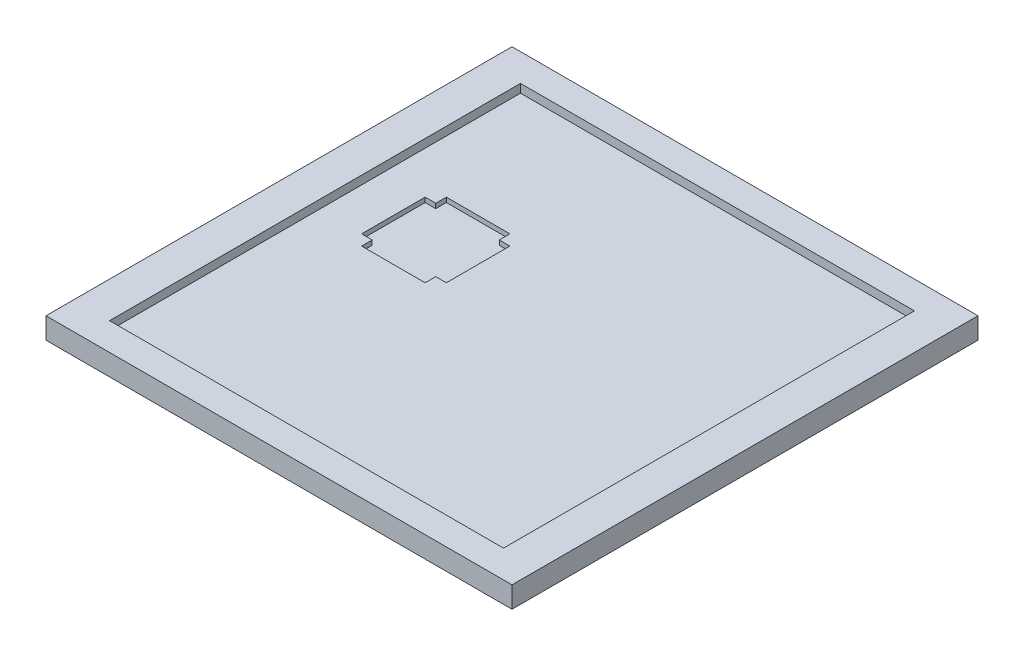
ISO-10303-21;
HEADER;
FILE_DESCRIPTION(('STEP AP214'),'2;1');
FILE_NAME('part.step','',(''),(''),'','','');
FILE_SCHEMA(('AUTOMOTIVE_DESIGN { 1 0 10303 214 1 1 1 1 }'));
ENDSEC;
DATA;
#1=APPLICATION_CONTEXT('core data for automotive mechanical design processes');
#2=APPLICATION_PROTOCOL_DEFINITION('international standard','automotive_design',2000,#1);
#3=PRODUCT_CONTEXT('',#1,'mechanical');
#4=PRODUCT('Part','Part','',(#3));
#5=PRODUCT_RELATED_PRODUCT_CATEGORY('part','',(#4));
#6=PRODUCT_DEFINITION_FORMATION('','',#4);
#7=PRODUCT_DEFINITION_CONTEXT('part definition',#1,'design');
#8=PRODUCT_DEFINITION('design','',#6,#7);
#9=PRODUCT_DEFINITION_SHAPE('','',#8);
#10=(LENGTH_UNIT() NAMED_UNIT(*) SI_UNIT(.MILLI.,.METRE.));
#11=(NAMED_UNIT(*) PLANE_ANGLE_UNIT() SI_UNIT($,.RADIAN.));
#12=(NAMED_UNIT(*) SI_UNIT($,.STERADIAN.) SOLID_ANGLE_UNIT());
#13=UNCERTAINTY_MEASURE_WITH_UNIT(LENGTH_MEASURE(1.E-05),#10,'distance_accuracy_value','');
#14=(GEOMETRIC_REPRESENTATION_CONTEXT(3) GLOBAL_UNCERTAINTY_ASSIGNED_CONTEXT((#13)) GLOBAL_UNIT_ASSIGNED_CONTEXT((#10,
#11,#12)) REPRESENTATION_CONTEXT('',''));
#15=CARTESIAN_POINT('',(0.,0.,0.));
#16=DIRECTION('',(0.,0.,1.));
#17=DIRECTION('',(1.,0.,0.));
#18=AXIS2_PLACEMENT_3D('',#15,#16,#17);
#19=CARTESIAN_POINT('',(-68.8630136986301,5.,-38.3493150684931));
#20=DIRECTION('',(1.,0.,0.));
#21=DIRECTION('',(0.,0.,-1.));
#22=AXIS2_PLACEMENT_3D('',#19,#20,#21);
#23=PLANE('',#22);
#24=DIRECTION('',(0.,0.,1.));
#25=VECTOR('',#24,1.);
#26=CARTESIAN_POINT('',(-68.8630136986301,0.,-38.3493150684931));
#27=LINE('',#26,#25);
#28=CARTESIAN_POINT('',(-68.8630136986301,0.,-38.3493150684931));
#29=VERTEX_POINT('',#28);
#30=CARTESIAN_POINT('',(-68.8630136986301,0.,71.6506849315068));
#31=VERTEX_POINT('',#30);
#32=EDGE_CURVE('E296',#29,#31,#27,.T.);
#33=ORIENTED_EDGE('',*,*,#32,.T.);
#34=DIRECTION('',(0.,-1.,0.));
#35=VECTOR('',#34,1.);
#36=CARTESIAN_POINT('',(-68.8630136986301,5.,71.6506849315068));
#37=LINE('',#36,#35);
#38=CARTESIAN_POINT('',(-68.8630136986301,5.,71.6506849315068));
#39=VERTEX_POINT('',#38);
#40=EDGE_CURVE('E11',#39,#31,#37,.T.);
#41=ORIENTED_EDGE('',*,*,#40,.F.);
#42=DIRECTION('',(0.,0.,1.));
#43=VECTOR('',#42,1.);
#44=CARTESIAN_POINT('',(-68.8630136986301,5.,-38.3493150684931));
#45=LINE('',#44,#43);
#46=CARTESIAN_POINT('',(-68.8630136986301,5.,-38.3493150684931));
#47=VERTEX_POINT('',#46);
#48=EDGE_CURVE('E302',#47,#39,#45,.T.);
#49=ORIENTED_EDGE('',*,*,#48,.F.);
#50=DIRECTION('',(0.,-1.,0.));
#51=VECTOR('',#50,1.);
#52=CARTESIAN_POINT('',(-68.8630136986301,5.,-38.3493150684931));
#53=LINE('',#52,#51);
#54=EDGE_CURVE('E312',#47,#29,#53,.T.);
#55=ORIENTED_EDGE('',*,*,#54,.T.);
#56=EDGE_LOOP('',(#33,#41,#49,#55));
#57=FACE_BOUND('',#56,.T.);
#58=ADVANCED_FACE('F33',(#57),#23,.F.);
#59=CARTESIAN_POINT('',(-68.8630136986301,5.,71.6506849315068));
#60=DIRECTION('',(0.,0.,-1.));
#61=DIRECTION('',(-1.,0.,0.));
#62=AXIS2_PLACEMENT_3D('',#59,#60,#61);
#63=PLANE('',#62);
#64=DIRECTION('',(1.,0.,0.));
#65=VECTOR('',#64,1.);
#66=CARTESIAN_POINT('',(-68.8630136986301,0.,71.6506849315068));
#67=LINE('',#66,#65);
#68=CARTESIAN_POINT('',(41.1369863013699,0.,71.6506849315068));
#69=VERTEX_POINT('',#68);
#70=EDGE_CURVE('E315',#31,#69,#67,.T.);
#71=ORIENTED_EDGE('',*,*,#70,.T.);
#72=DIRECTION('',(0.,-1.,0.));
#73=VECTOR('',#72,1.);
#74=CARTESIAN_POINT('',(41.1369863013699,5.,71.6506849315068));
#75=LINE('',#74,#73);
#76=CARTESIAN_POINT('',(41.1369863013699,5.,71.6506849315068));
#77=VERTEX_POINT('',#76);
#78=EDGE_CURVE('E40',#77,#69,#75,.T.);
#79=ORIENTED_EDGE('',*,*,#78,.F.);
#80=DIRECTION('',(1.,0.,0.));
#81=VECTOR('',#80,1.);
#82=CARTESIAN_POINT('',(-68.8630136986301,5.,71.6506849315068));
#83=LINE('',#82,#81);
#84=EDGE_CURVE('E305',#39,#77,#83,.T.);
#85=ORIENTED_EDGE('',*,*,#84,.F.);
#86=ORIENTED_EDGE('',*,*,#40,.T.);
#87=EDGE_LOOP('',(#71,#79,#85,#86));
#88=FACE_BOUND('',#87,.T.);
#89=ADVANCED_FACE('F345',(#88),#63,.F.);
#90=CARTESIAN_POINT('',(41.1369863013699,5.,-38.3493150684931));
#91=DIRECTION('',(-1.,0.,0.));
#92=DIRECTION('',(0.,0.,1.));
#93=AXIS2_PLACEMENT_3D('',#90,#91,#92);
#94=PLANE('',#93);
#95=DIRECTION('',(0.,0.,-1.));
#96=VECTOR('',#95,1.);
#97=CARTESIAN_POINT('',(41.1369863013699,0.,-38.3493150684931));
#98=LINE('',#97,#96);
#99=CARTESIAN_POINT('',(41.1369863013699,0.,-38.3493150684931));
#100=VERTEX_POINT('',#99);
#101=EDGE_CURVE('E317',#69,#100,#98,.T.);
#102=ORIENTED_EDGE('',*,*,#101,.T.);
#103=DIRECTION('',(0.,-1.,0.));
#104=VECTOR('',#103,1.);
#105=CARTESIAN_POINT('',(41.1369863013699,5.,-38.3493150684931));
#106=LINE('',#105,#104);
#107=CARTESIAN_POINT('',(41.1369863013699,5.,-38.3493150684931));
#108=VERTEX_POINT('',#107);
#109=EDGE_CURVE('E322',#108,#100,#106,.T.);
#110=ORIENTED_EDGE('',*,*,#109,.F.);
#111=DIRECTION('',(0.,0.,-1.));
#112=VECTOR('',#111,1.);
#113=CARTESIAN_POINT('',(41.1369863013699,5.,-38.3493150684931));
#114=LINE('',#113,#112);
#115=EDGE_CURVE('E308',#77,#108,#114,.T.);
#116=ORIENTED_EDGE('',*,*,#115,.F.);
#117=ORIENTED_EDGE('',*,*,#78,.T.);
#118=EDGE_LOOP('',(#102,#110,#116,#117));
#119=FACE_BOUND('',#118,.T.);
#120=ADVANCED_FACE('F329',(#119),#94,.F.);
#121=CARTESIAN_POINT('',(-68.8630136986301,5.,-38.3493150684931));
#122=DIRECTION('',(0.,0.,1.));
#123=DIRECTION('',(1.,0.,0.));
#124=AXIS2_PLACEMENT_3D('',#121,#122,#123);
#125=PLANE('',#124);
#126=DIRECTION('',(-1.,0.,0.));
#127=VECTOR('',#126,1.);
#128=CARTESIAN_POINT('',(-68.8630136986301,0.,-38.3493150684931));
#129=LINE('',#128,#127);
#130=EDGE_CURVE('E306',#100,#29,#129,.T.);
#131=ORIENTED_EDGE('',*,*,#130,.T.);
#132=ORIENTED_EDGE('',*,*,#54,.F.);
#133=DIRECTION('',(-1.,0.,0.));
#134=VECTOR('',#133,1.);
#135=CARTESIAN_POINT('',(-68.8630136986301,5.,-38.3493150684931));
#136=LINE('',#135,#134);
#137=EDGE_CURVE('E310',#108,#47,#136,.T.);
#138=ORIENTED_EDGE('',*,*,#137,.F.);
#139=ORIENTED_EDGE('',*,*,#109,.T.);
#140=EDGE_LOOP('',(#131,#132,#138,#139));
#141=FACE_BOUND('',#140,.T.);
#142=ADVANCED_FACE('F338',(#141),#125,.F.);
#143=CARTESIAN_POINT('',(0.,5.,0.));
#144=DIRECTION('',(0.,1.,0.));
#145=DIRECTION('',(0.,0.,1.));
#146=AXIS2_PLACEMENT_3D('',#143,#144,#145);
#147=PLANE('',#146);
#148=DIRECTION('',(0.,0.,1.));
#149=VECTOR('',#148,1.);
#150=CARTESIAN_POINT('',(-60.3630136986301,5.,-31.8493150684931));
#151=LINE('',#150,#149);
#152=CARTESIAN_POINT('',(-60.3630136986301,5.,-31.8493150684931));
#153=VERTEX_POINT('',#152);
#154=CARTESIAN_POINT('',(-60.3630136986301,5.,65.1506849315069));
#155=VERTEX_POINT('',#154);
#156=EDGE_CURVE('E55',#153,#155,#151,.T.);
#157=ORIENTED_EDGE('',*,*,#156,.F.);
#158=DIRECTION('',(-1.,0.,0.));
#159=VECTOR('',#158,1.);
#160=CARTESIAN_POINT('',(-60.3630136986301,5.,-31.8493150684931));
#161=LINE('',#160,#159);
#162=CARTESIAN_POINT('',(32.6369863013699,5.,-31.8493150684932));
#163=VERTEX_POINT('',#162);
#164=EDGE_CURVE('E275',#163,#153,#161,.T.);
#165=ORIENTED_EDGE('',*,*,#164,.F.);
#166=DIRECTION('',(0.,0.,-1.));
#167=VECTOR('',#166,1.);
#168=CARTESIAN_POINT('',(32.6369863013699,5.,-31.8493150684932));
#169=LINE('',#168,#167);
#170=CARTESIAN_POINT('',(32.6369863013699,5.,65.1506849315069));
#171=VERTEX_POINT('',#170);
#172=EDGE_CURVE('E289',#171,#163,#169,.T.);
#173=ORIENTED_EDGE('',*,*,#172,.F.);
#174=DIRECTION('',(1.,0.,0.));
#175=VECTOR('',#174,1.);
#176=CARTESIAN_POINT('',(-60.3630136986301,5.,65.1506849315069));
#177=LINE('',#176,#175);
#178=EDGE_CURVE('E286',#155,#171,#177,.T.);
#179=ORIENTED_EDGE('',*,*,#178,.F.);
#180=EDGE_LOOP('',(#157,#165,#173,#179));
#181=FACE_BOUND('',#180,.T.);
#182=ORIENTED_EDGE('',*,*,#48,.T.);
#183=ORIENTED_EDGE('',*,*,#84,.T.);
#184=ORIENTED_EDGE('',*,*,#115,.T.);
#185=ORIENTED_EDGE('',*,*,#137,.T.);
#186=EDGE_LOOP('',(#182,#183,#184,#185));
#187=FACE_BOUND('',#186,.T.);
#188=ADVANCED_FACE('F344',(#181,#187),#147,.T.);
#189=CARTESIAN_POINT('',(0.,0.,0.));
#190=DIRECTION('',(0.,1.,0.));
#191=DIRECTION('',(0.,0.,1.));
#192=AXIS2_PLACEMENT_3D('',#189,#190,#191);
#193=PLANE('',#192);
#194=ORIENTED_EDGE('',*,*,#32,.F.);
#195=ORIENTED_EDGE('',*,*,#130,.F.);
#196=ORIENTED_EDGE('',*,*,#101,.F.);
#197=ORIENTED_EDGE('',*,*,#70,.F.);
#198=EDGE_LOOP('',(#194,#195,#196,#197));
#199=FACE_BOUND('',#198,.T.);
#200=ADVANCED_FACE('F335',(#199),#193,.F.);
#201=CARTESIAN_POINT('',(-60.3630136986301,3.,-31.8493150684931));
#202=DIRECTION('',(-1.,0.,0.));
#203=DIRECTION('',(0.,0.,1.));
#204=AXIS2_PLACEMENT_3D('',#201,#202,#203);
#205=PLANE('',#204);
#206=ORIENTED_EDGE('',*,*,#156,.T.);
#207=DIRECTION('',(0.,1.,0.));
#208=VECTOR('',#207,1.);
#209=CARTESIAN_POINT('',(-60.3630136986301,3.,65.1506849315069));
#210=LINE('',#209,#208);
#211=CARTESIAN_POINT('',(-60.3630136986301,3.,65.1506849315069));
#212=VERTEX_POINT('',#211);
#213=EDGE_CURVE('E284',#212,#155,#210,.T.);
#214=ORIENTED_EDGE('',*,*,#213,.F.);
#215=DIRECTION('',(0.,0.,1.));
#216=VECTOR('',#215,1.);
#217=CARTESIAN_POINT('',(-60.3630136986301,3.,-31.8493150684931));
#218=LINE('',#217,#216);
#219=CARTESIAN_POINT('',(-60.3630136986301,3.,-31.8493150684931));
#220=VERTEX_POINT('',#219);
#221=EDGE_CURVE('E271',#220,#212,#218,.T.);
#222=ORIENTED_EDGE('',*,*,#221,.F.);
#223=DIRECTION('',(0.,1.,0.));
#224=VECTOR('',#223,1.);
#225=CARTESIAN_POINT('',(-60.3630136986301,3.,-31.8493150684931));
#226=LINE('',#225,#224);
#227=EDGE_CURVE('E294',#220,#153,#226,.T.);
#228=ORIENTED_EDGE('',*,*,#227,.T.);
#229=EDGE_LOOP('',(#206,#214,#222,#228));
#230=FACE_BOUND('',#229,.T.);
#231=ADVANCED_FACE('F357',(#230),#205,.F.);
#232=CARTESIAN_POINT('',(-60.3630136986301,3.,-31.8493150684931));
#233=DIRECTION('',(0.,0.,-1.));
#234=DIRECTION('',(-1.,0.,0.));
#235=AXIS2_PLACEMENT_3D('',#232,#233,#234);
#236=PLANE('',#235);
#237=ORIENTED_EDGE('',*,*,#164,.T.);
#238=ORIENTED_EDGE('',*,*,#227,.F.);
#239=DIRECTION('',(-1.,0.,0.));
#240=VECTOR('',#239,1.);
#241=CARTESIAN_POINT('',(-60.3630136986301,3.,-31.8493150684931));
#242=LINE('',#241,#240);
#243=CARTESIAN_POINT('',(32.6369863013699,3.,-31.8493150684932));
#244=VERTEX_POINT('',#243);
#245=EDGE_CURVE('E281',#244,#220,#242,.T.);
#246=ORIENTED_EDGE('',*,*,#245,.F.);
#247=DIRECTION('',(0.,1.,0.));
#248=VECTOR('',#247,1.);
#249=CARTESIAN_POINT('',(32.6369863013699,3.,-31.8493150684932));
#250=LINE('',#249,#248);
#251=EDGE_CURVE('E297',#244,#163,#250,.T.);
#252=ORIENTED_EDGE('',*,*,#251,.T.);
#253=EDGE_LOOP('',(#237,#238,#246,#252));
#254=FACE_BOUND('',#253,.T.);
#255=ADVANCED_FACE('F363',(#254),#236,.F.);
#256=CARTESIAN_POINT('',(32.6369863013699,3.,-31.8493150684932));
#257=DIRECTION('',(1.,0.,0.));
#258=DIRECTION('',(0.,0.,-1.));
#259=AXIS2_PLACEMENT_3D('',#256,#257,#258);
#260=PLANE('',#259);
#261=ORIENTED_EDGE('',*,*,#172,.T.);
#262=ORIENTED_EDGE('',*,*,#251,.F.);
#263=DIRECTION('',(0.,0.,-1.));
#264=VECTOR('',#263,1.);
#265=CARTESIAN_POINT('',(32.6369863013699,3.,-31.8493150684932));
#266=LINE('',#265,#264);
#267=CARTESIAN_POINT('',(32.6369863013699,3.,65.1506849315069));
#268=VERTEX_POINT('',#267);
#269=EDGE_CURVE('E278',#268,#244,#266,.T.);
#270=ORIENTED_EDGE('',*,*,#269,.F.);
#271=DIRECTION('',(0.,1.,0.));
#272=VECTOR('',#271,1.);
#273=CARTESIAN_POINT('',(32.6369863013699,3.,65.1506849315069));
#274=LINE('',#273,#272);
#275=EDGE_CURVE('E299',#268,#171,#274,.T.);
#276=ORIENTED_EDGE('',*,*,#275,.T.);
#277=EDGE_LOOP('',(#261,#262,#270,#276));
#278=FACE_BOUND('',#277,.T.);
#279=ADVANCED_FACE('F368',(#278),#260,.F.);
#280=CARTESIAN_POINT('',(-60.3630136986301,3.,65.1506849315069));
#281=DIRECTION('',(0.,0.,1.));
#282=DIRECTION('',(1.,0.,0.));
#283=AXIS2_PLACEMENT_3D('',#280,#281,#282);
#284=PLANE('',#283);
#285=ORIENTED_EDGE('',*,*,#178,.T.);
#286=ORIENTED_EDGE('',*,*,#275,.F.);
#287=DIRECTION('',(1.,0.,0.));
#288=VECTOR('',#287,1.);
#289=CARTESIAN_POINT('',(-60.3630136986301,3.,65.1506849315069));
#290=LINE('',#289,#288);
#291=EDGE_CURVE('E274',#212,#268,#290,.T.);
#292=ORIENTED_EDGE('',*,*,#291,.F.);
#293=ORIENTED_EDGE('',*,*,#213,.T.);
#294=EDGE_LOOP('',(#285,#286,#292,#293));
#295=FACE_BOUND('',#294,.T.);
#296=ADVANCED_FACE('F364',(#295),#284,.F.);
#297=CARTESIAN_POINT('',(0.,3.,0.));
#298=DIRECTION('',(0.,1.,0.));
#299=DIRECTION('',(0.,0.,1.));
#300=AXIS2_PLACEMENT_3D('',#297,#298,#299);
#301=PLANE('',#300);
#302=DIRECTION('',(0.,0.,-1.));
#303=VECTOR('',#302,1.);
#304=CARTESIAN_POINT('',(-30.3630136986301,3.,0.650684931506848));
#305=LINE('',#304,#303);
#306=CARTESIAN_POINT('',(-30.3630136986301,3.,15.6506849315068));
#307=VERTEX_POINT('',#306);
#308=CARTESIAN_POINT('',(-30.3630136986301,3.,0.650684931506848));
#309=VERTEX_POINT('',#308);
#310=EDGE_CURVE('E47',#307,#309,#305,.T.);
#311=ORIENTED_EDGE('',*,*,#310,.F.);
#312=DIRECTION('',(1.,0.,0.));
#313=VECTOR('',#312,1.);
#314=CARTESIAN_POINT('',(-30.3630136986301,3.,15.6506849315068));
#315=LINE('',#314,#313);
#316=CARTESIAN_POINT('',(-32.8630136986301,3.,15.6506849315068));
#317=VERTEX_POINT('',#316);
#318=EDGE_CURVE('E190',#317,#307,#315,.T.);
#319=ORIENTED_EDGE('',*,*,#318,.F.);
#320=DIRECTION('',(0.,0.,-1.));
#321=VECTOR('',#320,1.);
#322=CARTESIAN_POINT('',(-32.8630136986301,3.,15.6506849315068));
#323=LINE('',#322,#321);
#324=CARTESIAN_POINT('',(-32.8630136986301,3.,18.1506849315069));
#325=VERTEX_POINT('',#324);
#326=EDGE_CURVE('E193',#325,#317,#323,.T.);
#327=ORIENTED_EDGE('',*,*,#326,.F.);
#328=DIRECTION('',(1.,0.,0.));
#329=VECTOR('',#328,1.);
#330=CARTESIAN_POINT('',(-47.8630136986301,3.,18.1506849315069));
#331=LINE('',#330,#329);
#332=CARTESIAN_POINT('',(-47.8630136986301,3.,18.1506849315069));
#333=VERTEX_POINT('',#332);
#334=EDGE_CURVE('E245',#333,#325,#331,.T.);
#335=ORIENTED_EDGE('',*,*,#334,.F.);
#336=DIRECTION('',(0.,0.,1.));
#337=VECTOR('',#336,1.);
#338=CARTESIAN_POINT('',(-47.8630136986301,3.,15.6506849315069));
#339=LINE('',#338,#337);
#340=CARTESIAN_POINT('',(-47.8630136986301,3.,15.6506849315069));
#341=VERTEX_POINT('',#340);
#342=EDGE_CURVE('E242',#341,#333,#339,.T.);
#343=ORIENTED_EDGE('',*,*,#342,.F.);
#344=DIRECTION('',(1.,0.,0.));
#345=VECTOR('',#344,1.);
#346=CARTESIAN_POINT('',(-47.8630136986301,3.,15.6506849315069));
#347=LINE('',#346,#345);
#348=CARTESIAN_POINT('',(-50.3630136986301,3.,15.6506849315069));
#349=VERTEX_POINT('',#348);
#350=EDGE_CURVE('E239',#349,#341,#347,.T.);
#351=ORIENTED_EDGE('',*,*,#350,.F.);
#352=DIRECTION('',(0.,0.,1.));
#353=VECTOR('',#352,1.);
#354=CARTESIAN_POINT('',(-50.3630136986301,3.,0.65068493150685));
#355=LINE('',#354,#353);
#356=CARTESIAN_POINT('',(-50.3630136986301,3.,0.65068493150685));
#357=VERTEX_POINT('',#356);
#358=EDGE_CURVE('E236',#357,#349,#355,.T.);
#359=ORIENTED_EDGE('',*,*,#358,.F.);
#360=DIRECTION('',(-1.,0.,0.));
#361=VECTOR('',#360,1.);
#362=CARTESIAN_POINT('',(-47.8630136986301,3.,0.65068493150685));
#363=LINE('',#362,#361);
#364=CARTESIAN_POINT('',(-47.8630136986301,3.,0.65068493150685));
#365=VERTEX_POINT('',#364);
#366=EDGE_CURVE('E233',#365,#357,#363,.T.);
#367=ORIENTED_EDGE('',*,*,#366,.F.);
#368=DIRECTION('',(0.,0.,1.));
#369=VECTOR('',#368,1.);
#370=CARTESIAN_POINT('',(-47.8630136986301,3.,-1.84931506849315));
#371=LINE('',#370,#369);
#372=CARTESIAN_POINT('',(-47.8630136986301,3.,-1.84931506849315));
#373=VERTEX_POINT('',#372);
#374=EDGE_CURVE('E230',#373,#365,#371,.T.);
#375=ORIENTED_EDGE('',*,*,#374,.F.);
#376=DIRECTION('',(-1.,0.,0.));
#377=VECTOR('',#376,1.);
#378=CARTESIAN_POINT('',(-47.8630136986301,3.,-1.84931506849315));
#379=LINE('',#378,#377);
#380=CARTESIAN_POINT('',(-32.8630136986301,3.,-1.84931506849315));
#381=VERTEX_POINT('',#380);
#382=EDGE_CURVE('E227',#381,#373,#379,.T.);
#383=ORIENTED_EDGE('',*,*,#382,.F.);
#384=DIRECTION('',(0.,0.,-1.));
#385=VECTOR('',#384,1.);
#386=CARTESIAN_POINT('',(-32.8630136986301,3.,-1.84931506849315));
#387=LINE('',#386,#385);
#388=CARTESIAN_POINT('',(-32.8630136986301,3.,0.650684931506848));
#389=VERTEX_POINT('',#388);
#390=EDGE_CURVE('E224',#389,#381,#387,.T.);
#391=ORIENTED_EDGE('',*,*,#390,.F.);
#392=DIRECTION('',(-1.,0.,0.));
#393=VECTOR('',#392,1.);
#394=CARTESIAN_POINT('',(-30.3630136986301,3.,0.650684931506848));
#395=LINE('',#394,#393);
#396=EDGE_CURVE('E222',#309,#389,#395,.T.);
#397=ORIENTED_EDGE('',*,*,#396,.F.);
#398=EDGE_LOOP('',(#311,#319,#327,#335,#343,#351,#359,#367,#375,#383,#391,#397));
#399=FACE_BOUND('',#398,.T.);
#400=ORIENTED_EDGE('',*,*,#221,.T.);
#401=ORIENTED_EDGE('',*,*,#291,.T.);
#402=ORIENTED_EDGE('',*,*,#269,.T.);
#403=ORIENTED_EDGE('',*,*,#245,.T.);
#404=EDGE_LOOP('',(#400,#401,#402,#403));
#405=FACE_BOUND('',#404,.T.);
#406=ADVANCED_FACE('F367',(#399,#405),#301,.T.);
#407=CARTESIAN_POINT('',(-30.3630136986301,1.9,0.650684931506848));
#408=DIRECTION('',(1.,0.,0.));
#409=DIRECTION('',(0.,0.,-1.));
#410=AXIS2_PLACEMENT_3D('',#407,#408,#409);
#411=PLANE('',#410);
#412=ORIENTED_EDGE('',*,*,#310,.T.);
#413=DIRECTION('',(0.,1.,0.));
#414=VECTOR('',#413,1.);
#415=CARTESIAN_POINT('',(-30.3630136986301,1.9,0.650684931506848));
#416=LINE('',#415,#414);
#417=CARTESIAN_POINT('',(-30.3630136986301,1.9,0.650684931506848));
#418=VERTEX_POINT('',#417);
#419=EDGE_CURVE('E167',#418,#309,#416,.T.);
#420=ORIENTED_EDGE('',*,*,#419,.F.);
#421=DIRECTION('',(0.,0.,-1.));
#422=VECTOR('',#421,1.);
#423=CARTESIAN_POINT('',(-30.3630136986301,1.9,0.650684931506848));
#424=LINE('',#423,#422);
#425=CARTESIAN_POINT('',(-30.3630136986301,1.9,15.6506849315068));
#426=VERTEX_POINT('',#425);
#427=EDGE_CURVE('E171',#426,#418,#424,.T.);
#428=ORIENTED_EDGE('',*,*,#427,.F.);
#429=DIRECTION('',(0.,1.,0.));
#430=VECTOR('',#429,1.);
#431=CARTESIAN_POINT('',(-30.3630136986301,1.9,15.6506849315068));
#432=LINE('',#431,#430);
#433=EDGE_CURVE('E250',#426,#307,#432,.T.);
#434=ORIENTED_EDGE('',*,*,#433,.T.);
#435=EDGE_LOOP('',(#412,#420,#428,#434));
#436=FACE_BOUND('',#435,.T.);
#437=ADVANCED_FACE('F169',(#436),#411,.F.);
#438=CARTESIAN_POINT('',(-30.3630136986301,1.9,15.6506849315068));
#439=DIRECTION('',(0.,0.,1.));
#440=DIRECTION('',(1.,0.,0.));
#441=AXIS2_PLACEMENT_3D('',#438,#439,#440);
#442=PLANE('',#441);
#443=ORIENTED_EDGE('',*,*,#318,.T.);
#444=ORIENTED_EDGE('',*,*,#433,.F.);
#445=DIRECTION('',(1.,0.,0.));
#446=VECTOR('',#445,1.);
#447=CARTESIAN_POINT('',(-30.3630136986301,1.9,15.6506849315068));
#448=LINE('',#447,#446);
#449=CARTESIAN_POINT('',(-32.8630136986301,1.9,15.6506849315068));
#450=VERTEX_POINT('',#449);
#451=EDGE_CURVE('E177',#450,#426,#448,.T.);
#452=ORIENTED_EDGE('',*,*,#451,.F.);
#453=DIRECTION('',(0.,1.,0.));
#454=VECTOR('',#453,1.);
#455=CARTESIAN_POINT('',(-32.8630136986301,1.9,15.6506849315068));
#456=LINE('',#455,#454);
#457=EDGE_CURVE('E252',#450,#317,#456,.T.);
#458=ORIENTED_EDGE('',*,*,#457,.T.);
#459=EDGE_LOOP('',(#443,#444,#452,#458));
#460=FACE_BOUND('',#459,.T.);
#461=ADVANCED_FACE('F381',(#460),#442,.F.);
#462=CARTESIAN_POINT('',(-32.8630136986301,1.9,15.6506849315068));
#463=DIRECTION('',(1.,0.,0.));
#464=DIRECTION('',(0.,0.,-1.));
#465=AXIS2_PLACEMENT_3D('',#462,#463,#464);
#466=PLANE('',#465);
#467=ORIENTED_EDGE('',*,*,#326,.T.);
#468=ORIENTED_EDGE('',*,*,#457,.F.);
#469=DIRECTION('',(0.,0.,-1.));
#470=VECTOR('',#469,1.);
#471=CARTESIAN_POINT('',(-32.8630136986301,1.9,15.6506849315068));
#472=LINE('',#471,#470);
#473=CARTESIAN_POINT('',(-32.8630136986301,1.9,18.1506849315069));
#474=VERTEX_POINT('',#473);
#475=EDGE_CURVE('E218',#474,#450,#472,.T.);
#476=ORIENTED_EDGE('',*,*,#475,.F.);
#477=DIRECTION('',(0.,1.,0.));
#478=VECTOR('',#477,1.);
#479=CARTESIAN_POINT('',(-32.8630136986301,1.9,18.1506849315069));
#480=LINE('',#479,#478);
#481=EDGE_CURVE('E254',#474,#325,#480,.T.);
#482=ORIENTED_EDGE('',*,*,#481,.T.);
#483=EDGE_LOOP('',(#467,#468,#476,#482));
#484=FACE_BOUND('',#483,.T.);
#485=ADVANCED_FACE('F415',(#484),#466,.F.);
#486=CARTESIAN_POINT('',(-47.8630136986301,1.9,18.1506849315069));
#487=DIRECTION('',(0.,0.,1.));
#488=DIRECTION('',(1.,0.,0.));
#489=AXIS2_PLACEMENT_3D('',#486,#487,#488);
#490=PLANE('',#489);
#491=ORIENTED_EDGE('',*,*,#334,.T.);
#492=ORIENTED_EDGE('',*,*,#481,.F.);
#493=DIRECTION('',(1.,0.,0.));
#494=VECTOR('',#493,1.);
#495=CARTESIAN_POINT('',(-47.8630136986301,1.9,18.1506849315069));
#496=LINE('',#495,#494);
#497=CARTESIAN_POINT('',(-47.8630136986301,1.9,18.1506849315069));
#498=VERTEX_POINT('',#497);
#499=EDGE_CURVE('E215',#498,#474,#496,.T.);
#500=ORIENTED_EDGE('',*,*,#499,.F.);
#501=DIRECTION('',(0.,1.,0.));
#502=VECTOR('',#501,1.);
#503=CARTESIAN_POINT('',(-47.8630136986301,1.9,18.1506849315069));
#504=LINE('',#503,#502);
#505=EDGE_CURVE('E256',#498,#333,#504,.T.);
#506=ORIENTED_EDGE('',*,*,#505,.T.);
#507=EDGE_LOOP('',(#491,#492,#500,#506));
#508=FACE_BOUND('',#507,.T.);
#509=ADVANCED_FACE('F411',(#508),#490,.F.);
#510=CARTESIAN_POINT('',(-47.8630136986301,1.9,15.6506849315069));
#511=DIRECTION('',(-1.,0.,0.));
#512=DIRECTION('',(0.,0.,1.));
#513=AXIS2_PLACEMENT_3D('',#510,#511,#512);
#514=PLANE('',#513);
#515=ORIENTED_EDGE('',*,*,#342,.T.);
#516=ORIENTED_EDGE('',*,*,#505,.F.);
#517=DIRECTION('',(0.,0.,1.));
#518=VECTOR('',#517,1.);
#519=CARTESIAN_POINT('',(-47.8630136986301,1.9,15.6506849315069));
#520=LINE('',#519,#518);
#521=CARTESIAN_POINT('',(-47.8630136986301,1.9,15.6506849315069));
#522=VERTEX_POINT('',#521);
#523=EDGE_CURVE('E212',#522,#498,#520,.T.);
#524=ORIENTED_EDGE('',*,*,#523,.F.);
#525=DIRECTION('',(0.,1.,0.));
#526=VECTOR('',#525,1.);
#527=CARTESIAN_POINT('',(-47.8630136986301,1.9,15.6506849315069));
#528=LINE('',#527,#526);
#529=EDGE_CURVE('E258',#522,#341,#528,.T.);
#530=ORIENTED_EDGE('',*,*,#529,.T.);
#531=EDGE_LOOP('',(#515,#516,#524,#530));
#532=FACE_BOUND('',#531,.T.);
#533=ADVANCED_FACE('F407',(#532),#514,.F.);
#534=CARTESIAN_POINT('',(-47.8630136986301,1.9,15.6506849315069));
#535=DIRECTION('',(0.,0.,1.));
#536=DIRECTION('',(1.,0.,0.));
#537=AXIS2_PLACEMENT_3D('',#534,#535,#536);
#538=PLANE('',#537);
#539=ORIENTED_EDGE('',*,*,#350,.T.);
#540=ORIENTED_EDGE('',*,*,#529,.F.);
#541=DIRECTION('',(1.,0.,0.));
#542=VECTOR('',#541,1.);
#543=CARTESIAN_POINT('',(-47.8630136986301,1.9,15.6506849315069));
#544=LINE('',#543,#542);
#545=CARTESIAN_POINT('',(-50.3630136986301,1.9,15.6506849315069));
#546=VERTEX_POINT('',#545);
#547=EDGE_CURVE('E209',#546,#522,#544,.T.);
#548=ORIENTED_EDGE('',*,*,#547,.F.);
#549=DIRECTION('',(0.,1.,0.));
#550=VECTOR('',#549,1.);
#551=CARTESIAN_POINT('',(-50.3630136986301,1.9,15.6506849315069));
#552=LINE('',#551,#550);
#553=EDGE_CURVE('E260',#546,#349,#552,.T.);
#554=ORIENTED_EDGE('',*,*,#553,.T.);
#555=EDGE_LOOP('',(#539,#540,#548,#554));
#556=FACE_BOUND('',#555,.T.);
#557=ADVANCED_FACE('F403',(#556),#538,.F.);
#558=CARTESIAN_POINT('',(-50.3630136986301,1.9,0.65068493150685));
#559=DIRECTION('',(-1.,0.,0.));
#560=DIRECTION('',(0.,0.,1.));
#561=AXIS2_PLACEMENT_3D('',#558,#559,#560);
#562=PLANE('',#561);
#563=ORIENTED_EDGE('',*,*,#358,.T.);
#564=ORIENTED_EDGE('',*,*,#553,.F.);
#565=DIRECTION('',(0.,0.,1.));
#566=VECTOR('',#565,1.);
#567=CARTESIAN_POINT('',(-50.3630136986301,1.9,0.65068493150685));
#568=LINE('',#567,#566);
#569=CARTESIAN_POINT('',(-50.3630136986301,1.9,0.65068493150685));
#570=VERTEX_POINT('',#569);
#571=EDGE_CURVE('E206',#570,#546,#568,.T.);
#572=ORIENTED_EDGE('',*,*,#571,.F.);
#573=DIRECTION('',(0.,1.,0.));
#574=VECTOR('',#573,1.);
#575=CARTESIAN_POINT('',(-50.3630136986301,1.9,0.65068493150685));
#576=LINE('',#575,#574);
#577=EDGE_CURVE('E262',#570,#357,#576,.T.);
#578=ORIENTED_EDGE('',*,*,#577,.T.);
#579=EDGE_LOOP('',(#563,#564,#572,#578));
#580=FACE_BOUND('',#579,.T.);
#581=ADVANCED_FACE('F399',(#580),#562,.F.);
#582=CARTESIAN_POINT('',(-47.8630136986301,1.9,0.65068493150685));
#583=DIRECTION('',(0.,0.,-1.));
#584=DIRECTION('',(-1.,0.,0.));
#585=AXIS2_PLACEMENT_3D('',#582,#583,#584);
#586=PLANE('',#585);
#587=ORIENTED_EDGE('',*,*,#366,.T.);
#588=ORIENTED_EDGE('',*,*,#577,.F.);
#589=DIRECTION('',(-1.,0.,0.));
#590=VECTOR('',#589,1.);
#591=CARTESIAN_POINT('',(-47.8630136986301,1.9,0.65068493150685));
#592=LINE('',#591,#590);
#593=CARTESIAN_POINT('',(-47.8630136986301,1.9,0.65068493150685));
#594=VERTEX_POINT('',#593);
#595=EDGE_CURVE('E203',#594,#570,#592,.T.);
#596=ORIENTED_EDGE('',*,*,#595,.F.);
#597=DIRECTION('',(0.,1.,0.));
#598=VECTOR('',#597,1.);
#599=CARTESIAN_POINT('',(-47.8630136986301,1.9,0.65068493150685));
#600=LINE('',#599,#598);
#601=EDGE_CURVE('E264',#594,#365,#600,.T.);
#602=ORIENTED_EDGE('',*,*,#601,.T.);
#603=EDGE_LOOP('',(#587,#588,#596,#602));
#604=FACE_BOUND('',#603,.T.);
#605=ADVANCED_FACE('F395',(#604),#586,.F.);
#606=CARTESIAN_POINT('',(-47.8630136986301,1.9,-1.84931506849315));
#607=DIRECTION('',(-1.,0.,0.));
#608=DIRECTION('',(0.,0.,1.));
#609=AXIS2_PLACEMENT_3D('',#606,#607,#608);
#610=PLANE('',#609);
#611=ORIENTED_EDGE('',*,*,#374,.T.);
#612=ORIENTED_EDGE('',*,*,#601,.F.);
#613=DIRECTION('',(0.,0.,1.));
#614=VECTOR('',#613,1.);
#615=CARTESIAN_POINT('',(-47.8630136986301,1.9,-1.84931506849315));
#616=LINE('',#615,#614);
#617=CARTESIAN_POINT('',(-47.8630136986301,1.9,-1.84931506849315));
#618=VERTEX_POINT('',#617);
#619=EDGE_CURVE('E200',#618,#594,#616,.T.);
#620=ORIENTED_EDGE('',*,*,#619,.F.);
#621=DIRECTION('',(0.,1.,0.));
#622=VECTOR('',#621,1.);
#623=CARTESIAN_POINT('',(-47.8630136986301,1.9,-1.84931506849315));
#624=LINE('',#623,#622);
#625=EDGE_CURVE('E266',#618,#373,#624,.T.);
#626=ORIENTED_EDGE('',*,*,#625,.T.);
#627=EDGE_LOOP('',(#611,#612,#620,#626));
#628=FACE_BOUND('',#627,.T.);
#629=ADVANCED_FACE('F391',(#628),#610,.F.);
#630=CARTESIAN_POINT('',(-47.8630136986301,1.9,-1.84931506849315));
#631=DIRECTION('',(0.,0.,-1.));
#632=DIRECTION('',(-1.,0.,0.));
#633=AXIS2_PLACEMENT_3D('',#630,#631,#632);
#634=PLANE('',#633);
#635=ORIENTED_EDGE('',*,*,#382,.T.);
#636=ORIENTED_EDGE('',*,*,#625,.F.);
#637=DIRECTION('',(-1.,0.,0.));
#638=VECTOR('',#637,1.);
#639=CARTESIAN_POINT('',(-47.8630136986301,1.9,-1.84931506849315));
#640=LINE('',#639,#638);
#641=CARTESIAN_POINT('',(-32.8630136986301,1.9,-1.84931506849315));
#642=VERTEX_POINT('',#641);
#643=EDGE_CURVE('E197',#642,#618,#640,.T.);
#644=ORIENTED_EDGE('',*,*,#643,.F.);
#645=DIRECTION('',(0.,1.,0.));
#646=VECTOR('',#645,1.);
#647=CARTESIAN_POINT('',(-32.8630136986301,1.9,-1.84931506849315));
#648=LINE('',#647,#646);
#649=EDGE_CURVE('E268',#642,#381,#648,.T.);
#650=ORIENTED_EDGE('',*,*,#649,.T.);
#651=EDGE_LOOP('',(#635,#636,#644,#650));
#652=FACE_BOUND('',#651,.T.);
#653=ADVANCED_FACE('F387',(#652),#634,.F.);
#654=CARTESIAN_POINT('',(-32.8630136986301,1.9,-1.84931506849315));
#655=DIRECTION('',(1.,0.,0.));
#656=DIRECTION('',(0.,0.,-1.));
#657=AXIS2_PLACEMENT_3D('',#654,#655,#656);
#658=PLANE('',#657);
#659=ORIENTED_EDGE('',*,*,#390,.T.);
#660=ORIENTED_EDGE('',*,*,#649,.F.);
#661=DIRECTION('',(0.,0.,-1.));
#662=VECTOR('',#661,1.);
#663=CARTESIAN_POINT('',(-32.8630136986301,1.9,-1.84931506849315));
#664=LINE('',#663,#662);
#665=CARTESIAN_POINT('',(-32.8630136986301,1.9,0.650684931506848));
#666=VERTEX_POINT('',#665);
#667=EDGE_CURVE('E185',#666,#642,#664,.T.);
#668=ORIENTED_EDGE('',*,*,#667,.F.);
#669=DIRECTION('',(0.,1.,0.));
#670=VECTOR('',#669,1.);
#671=CARTESIAN_POINT('',(-32.8630136986301,1.9,0.650684931506848));
#672=LINE('',#671,#670);
#673=EDGE_CURVE('E176',#666,#389,#672,.T.);
#674=ORIENTED_EDGE('',*,*,#673,.T.);
#675=EDGE_LOOP('',(#659,#660,#668,#674));
#676=FACE_BOUND('',#675,.T.);
#677=ADVANCED_FACE('F384',(#676),#658,.F.);
#678=CARTESIAN_POINT('',(-30.3630136986301,1.9,0.650684931506848));
#679=DIRECTION('',(0.,0.,-1.));
#680=DIRECTION('',(-1.,0.,0.));
#681=AXIS2_PLACEMENT_3D('',#678,#679,#680);
#682=PLANE('',#681);
#683=ORIENTED_EDGE('',*,*,#396,.T.);
#684=ORIENTED_EDGE('',*,*,#673,.F.);
#685=DIRECTION('',(-1.,0.,0.));
#686=VECTOR('',#685,1.);
#687=CARTESIAN_POINT('',(-30.3630136986301,1.9,0.650684931506848));
#688=LINE('',#687,#686);
#689=EDGE_CURVE('E180',#418,#666,#688,.T.);
#690=ORIENTED_EDGE('',*,*,#689,.F.);
#691=ORIENTED_EDGE('',*,*,#419,.T.);
#692=EDGE_LOOP('',(#683,#684,#690,#691));
#693=FACE_BOUND('',#692,.T.);
#694=ADVANCED_FACE('F181',(#693),#682,.F.);
#695=CARTESIAN_POINT('',(0.,1.9,0.));
#696=DIRECTION('',(0.,-1.,0.));
#697=DIRECTION('',(0.,0.,-1.));
#698=AXIS2_PLACEMENT_3D('',#695,#696,#697);
#699=PLANE('',#698);
#700=ORIENTED_EDGE('',*,*,#427,.T.);
#701=ORIENTED_EDGE('',*,*,#689,.T.);
#702=ORIENTED_EDGE('',*,*,#667,.T.);
#703=ORIENTED_EDGE('',*,*,#643,.T.);
#704=ORIENTED_EDGE('',*,*,#619,.T.);
#705=ORIENTED_EDGE('',*,*,#595,.T.);
#706=ORIENTED_EDGE('',*,*,#571,.T.);
#707=ORIENTED_EDGE('',*,*,#547,.T.);
#708=ORIENTED_EDGE('',*,*,#523,.T.);
#709=ORIENTED_EDGE('',*,*,#499,.T.);
#710=ORIENTED_EDGE('',*,*,#475,.T.);
#711=ORIENTED_EDGE('',*,*,#451,.T.);
#712=EDGE_LOOP('',(#700,#701,#702,#703,#704,#705,#706,#707,#708,#709,#710,#711));
#713=FACE_BOUND('',#712,.T.);
#714=ADVANCED_FACE('F187',(#713),#699,.F.);
#715=CLOSED_SHELL('',(#58,#89,#120,#142,#188,#200,#231,#255,#279,#296,#406,#437,#461,#485,#509,
#533,#557,#581,#605,#629,#653,#677,#694,#714));
#716=MANIFOLD_SOLID_BREP('B2',#715);
#717=ADVANCED_BREP_SHAPE_REPRESENTATION('',(#18,#716),#14);
#718=SHAPE_DEFINITION_REPRESENTATION(#9,#717);
ENDSEC;
END-ISO-10303-21;
